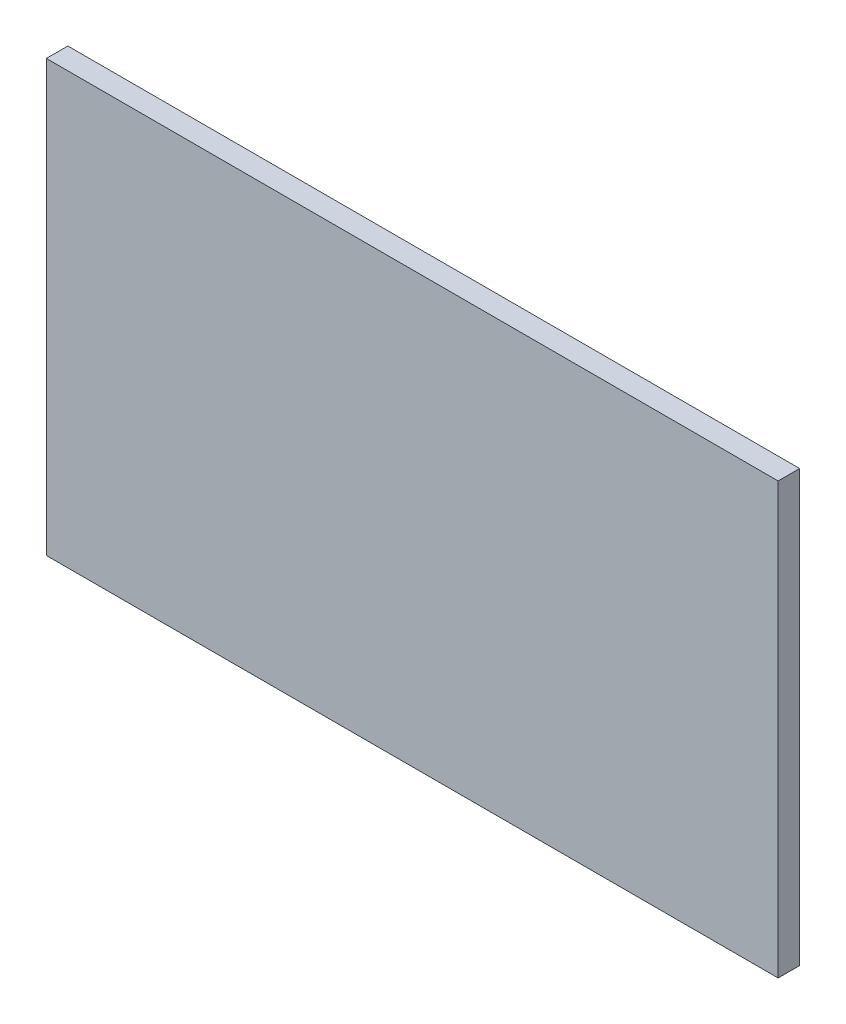
ISO-10303-21;
HEADER;
FILE_DESCRIPTION(('STEP AP214'),'2;1');
FILE_NAME('part.step','',(''),(''),'','','');
FILE_SCHEMA(('AUTOMOTIVE_DESIGN { 1 0 10303 214 1 1 1 1 }'));
ENDSEC;
DATA;
#1=APPLICATION_CONTEXT('core data for automotive mechanical design processes');
#2=APPLICATION_PROTOCOL_DEFINITION('international standard','automotive_design',2000,#1);
#3=PRODUCT_CONTEXT('',#1,'mechanical');
#4=PRODUCT('Part','Part','',(#3));
#5=PRODUCT_RELATED_PRODUCT_CATEGORY('part','',(#4));
#6=PRODUCT_DEFINITION_FORMATION('','',#4);
#7=PRODUCT_DEFINITION_CONTEXT('part definition',#1,'design');
#8=PRODUCT_DEFINITION('design','',#6,#7);
#9=PRODUCT_DEFINITION_SHAPE('','',#8);
#10=(LENGTH_UNIT() NAMED_UNIT(*) SI_UNIT(.MILLI.,.METRE.));
#11=(NAMED_UNIT(*) PLANE_ANGLE_UNIT() SI_UNIT($,.RADIAN.));
#12=(NAMED_UNIT(*) SI_UNIT($,.STERADIAN.) SOLID_ANGLE_UNIT());
#13=UNCERTAINTY_MEASURE_WITH_UNIT(LENGTH_MEASURE(1.E-05),#10,'distance_accuracy_value','');
#14=(GEOMETRIC_REPRESENTATION_CONTEXT(3) GLOBAL_UNCERTAINTY_ASSIGNED_CONTEXT((#13)) GLOBAL_UNIT_ASSIGNED_CONTEXT((#10,
#11,#12)) REPRESENTATION_CONTEXT('',''));
#15=CARTESIAN_POINT('',(0.,0.,0.));
#16=DIRECTION('',(0.,0.,1.));
#17=DIRECTION('',(1.,0.,0.));
#18=AXIS2_PLACEMENT_3D('',#15,#16,#17);
#19=CARTESIAN_POINT('',(0.,0.,5.));
#20=DIRECTION('',(1.,0.,0.));
#21=DIRECTION('',(0.,0.,-1.));
#22=AXIS2_PLACEMENT_3D('',#19,#20,#21);
#23=PLANE('',#22);
#24=DIRECTION('',(0.,-1.,0.));
#25=VECTOR('',#24,1.);
#26=CARTESIAN_POINT('',(0.,0.,0.));
#27=LINE('',#26,#25);
#28=CARTESIAN_POINT('',(0.,100.,0.));
#29=VERTEX_POINT('',#28);
#30=CARTESIAN_POINT('',(0.,0.,0.));
#31=VERTEX_POINT('',#30);
#32=EDGE_CURVE('E96',#29,#31,#27,.T.);
#33=ORIENTED_EDGE('',*,*,#32,.T.);
#34=DIRECTION('',(0.,0.,-1.));
#35=VECTOR('',#34,1.);
#36=CARTESIAN_POINT('',(0.,0.,5.));
#37=LINE('',#36,#35);
#38=CARTESIAN_POINT('',(0.,0.,5.));
#39=VERTEX_POINT('',#38);
#40=EDGE_CURVE('E11',#39,#31,#37,.T.);
#41=ORIENTED_EDGE('',*,*,#40,.F.);
#42=DIRECTION('',(0.,-1.,0.));
#43=VECTOR('',#42,1.);
#44=CARTESIAN_POINT('',(0.,0.,5.));
#45=LINE('',#44,#43);
#46=CARTESIAN_POINT('',(0.,100.,5.));
#47=VERTEX_POINT('',#46);
#48=EDGE_CURVE('E84',#47,#39,#45,.T.);
#49=ORIENTED_EDGE('',*,*,#48,.F.);
#50=DIRECTION('',(0.,0.,-1.));
#51=VECTOR('',#50,1.);
#52=CARTESIAN_POINT('',(0.,100.,5.));
#53=LINE('',#52,#51);
#54=EDGE_CURVE('E92',#47,#29,#53,.T.);
#55=ORIENTED_EDGE('',*,*,#54,.T.);
#56=EDGE_LOOP('',(#33,#41,#49,#55));
#57=FACE_BOUND('',#56,.T.);
#58=ADVANCED_FACE('F33',(#57),#23,.F.);
#59=CARTESIAN_POINT('',(0.,0.,5.));
#60=DIRECTION('',(0.,1.,0.));
#61=DIRECTION('',(0.,0.,1.));
#62=AXIS2_PLACEMENT_3D('',#59,#60,#61);
#63=PLANE('',#62);
#64=DIRECTION('',(1.,0.,0.));
#65=VECTOR('',#64,1.);
#66=CARTESIAN_POINT('',(0.,0.,0.));
#67=LINE('',#66,#65);
#68=CARTESIAN_POINT('',(170.,0.,0.));
#69=VERTEX_POINT('',#68);
#70=EDGE_CURVE('E88',#31,#69,#67,.T.);
#71=ORIENTED_EDGE('',*,*,#70,.T.);
#72=DIRECTION('',(0.,0.,-1.));
#73=VECTOR('',#72,1.);
#74=CARTESIAN_POINT('',(170.,0.,5.));
#75=LINE('',#74,#73);
#76=CARTESIAN_POINT('',(170.,0.,5.));
#77=VERTEX_POINT('',#76);
#78=EDGE_CURVE('E41',#77,#69,#75,.T.);
#79=ORIENTED_EDGE('',*,*,#78,.F.);
#80=DIRECTION('',(1.,0.,0.));
#81=VECTOR('',#80,1.);
#82=CARTESIAN_POINT('',(0.,0.,5.));
#83=LINE('',#82,#81);
#84=EDGE_CURVE('E79',#39,#77,#83,.T.);
#85=ORIENTED_EDGE('',*,*,#84,.F.);
#86=ORIENTED_EDGE('',*,*,#40,.T.);
#87=EDGE_LOOP('',(#71,#79,#85,#86));
#88=FACE_BOUND('',#87,.T.);
#89=ADVANCED_FACE('F87',(#88),#63,.F.);
#90=CARTESIAN_POINT('',(170.,0.,5.));
#91=DIRECTION('',(-1.,0.,0.));
#92=DIRECTION('',(0.,0.,1.));
#93=AXIS2_PLACEMENT_3D('',#90,#91,#92);
#94=PLANE('',#93);
#95=DIRECTION('',(0.,1.,0.));
#96=VECTOR('',#95,1.);
#97=CARTESIAN_POINT('',(170.,0.,0.));
#98=LINE('',#97,#96);
#99=CARTESIAN_POINT('',(170.,100.,0.));
#100=VERTEX_POINT('',#99);
#101=EDGE_CURVE('E66',#69,#100,#98,.T.);
#102=ORIENTED_EDGE('',*,*,#101,.T.);
#103=DIRECTION('',(0.,0.,-1.));
#104=VECTOR('',#103,1.);
#105=CARTESIAN_POINT('',(170.,100.,5.));
#106=LINE('',#105,#104);
#107=CARTESIAN_POINT('',(170.,100.,5.));
#108=VERTEX_POINT('',#107);
#109=EDGE_CURVE('E89',#108,#100,#106,.T.);
#110=ORIENTED_EDGE('',*,*,#109,.F.);
#111=DIRECTION('',(0.,1.,0.));
#112=VECTOR('',#111,1.);
#113=CARTESIAN_POINT('',(170.,0.,5.));
#114=LINE('',#113,#112);
#115=EDGE_CURVE('E82',#77,#108,#114,.T.);
#116=ORIENTED_EDGE('',*,*,#115,.F.);
#117=ORIENTED_EDGE('',*,*,#78,.T.);
#118=EDGE_LOOP('',(#102,#110,#116,#117));
#119=FACE_BOUND('',#118,.T.);
#120=ADVANCED_FACE('F90',(#119),#94,.F.);
#121=CARTESIAN_POINT('',(0.,100.,5.));
#122=DIRECTION('',(0.,-1.,0.));
#123=DIRECTION('',(0.,0.,-1.));
#124=AXIS2_PLACEMENT_3D('',#121,#122,#123);
#125=PLANE('',#124);
#126=DIRECTION('',(-1.,0.,0.));
#127=VECTOR('',#126,1.);
#128=CARTESIAN_POINT('',(0.,100.,0.));
#129=LINE('',#128,#127);
#130=EDGE_CURVE('E72',#100,#29,#129,.T.);
#131=ORIENTED_EDGE('',*,*,#130,.T.);
#132=ORIENTED_EDGE('',*,*,#54,.F.);
#133=DIRECTION('',(-1.,0.,0.));
#134=VECTOR('',#133,1.);
#135=CARTESIAN_POINT('',(0.,100.,5.));
#136=LINE('',#135,#134);
#137=EDGE_CURVE('E49',#108,#47,#136,.T.);
#138=ORIENTED_EDGE('',*,*,#137,.F.);
#139=ORIENTED_EDGE('',*,*,#109,.T.);
#140=EDGE_LOOP('',(#131,#132,#138,#139));
#141=FACE_BOUND('',#140,.T.);
#142=ADVANCED_FACE('F103',(#141),#125,.F.);
#143=CARTESIAN_POINT('',(0.,0.,5.));
#144=DIRECTION('',(0.,0.,-1.));
#145=DIRECTION('',(-1.,0.,0.));
#146=AXIS2_PLACEMENT_3D('',#143,#144,#145);
#147=PLANE('',#146);
#148=ORIENTED_EDGE('',*,*,#48,.T.);
#149=ORIENTED_EDGE('',*,*,#84,.T.);
#150=ORIENTED_EDGE('',*,*,#115,.T.);
#151=ORIENTED_EDGE('',*,*,#137,.T.);
#152=EDGE_LOOP('',(#148,#149,#150,#151));
#153=FACE_BOUND('',#152,.T.);
#154=ADVANCED_FACE('F80',(#153),#147,.F.);
#155=CARTESIAN_POINT('',(0.,0.,0.));
#156=DIRECTION('',(0.,0.,-1.));
#157=DIRECTION('',(-1.,0.,0.));
#158=AXIS2_PLACEMENT_3D('',#155,#156,#157);
#159=PLANE('',#158);
#160=ORIENTED_EDGE('',*,*,#32,.F.);
#161=ORIENTED_EDGE('',*,*,#130,.F.);
#162=ORIENTED_EDGE('',*,*,#101,.F.);
#163=ORIENTED_EDGE('',*,*,#70,.F.);
#164=EDGE_LOOP('',(#160,#161,#162,#163));
#165=FACE_BOUND('',#164,.T.);
#166=ADVANCED_FACE('F106',(#165),#159,.T.);
#167=CLOSED_SHELL('',(#58,#89,#120,#142,#154,#166));
#168=MANIFOLD_SOLID_BREP('B2',#167);
#169=ADVANCED_BREP_SHAPE_REPRESENTATION('',(#18,#168),#14);
#170=SHAPE_DEFINITION_REPRESENTATION(#9,#169);
ENDSEC;
END-ISO-10303-21;
